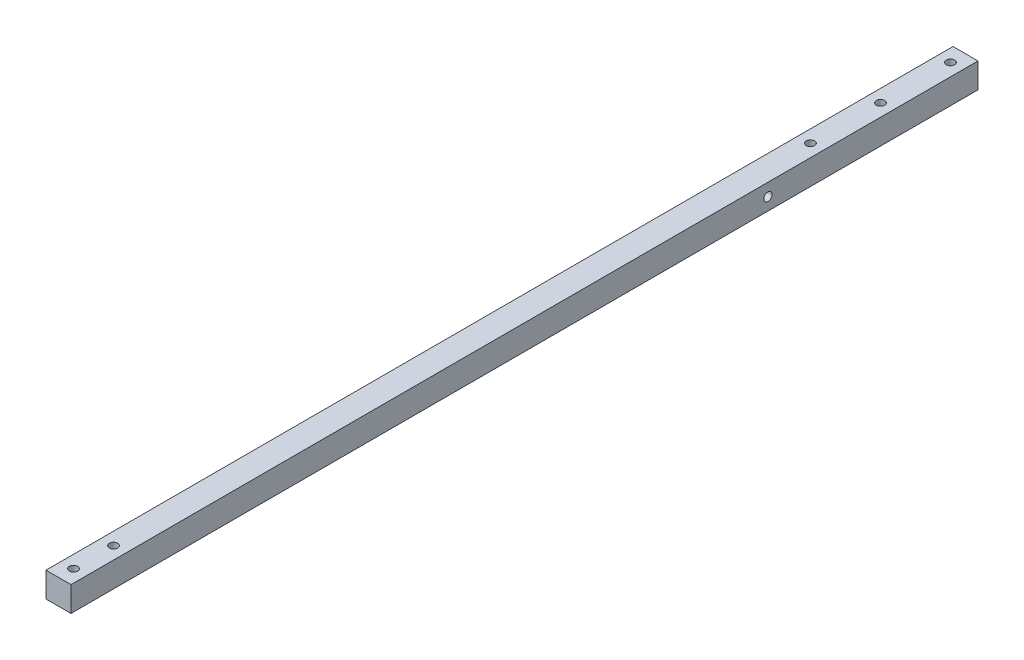
ISO-10303-21;
HEADER;
FILE_DESCRIPTION(('STEP AP214'),'2;1');
FILE_NAME('part.step','',(''),(''),'','','');
FILE_SCHEMA(('AUTOMOTIVE_DESIGN { 1 0 10303 214 1 1 1 1 }'));
ENDSEC;
DATA;
#1=APPLICATION_CONTEXT('core data for automotive mechanical design processes');
#2=APPLICATION_PROTOCOL_DEFINITION('international standard','automotive_design',2000,#1);
#3=PRODUCT_CONTEXT('',#1,'mechanical');
#4=PRODUCT('Part','Part','',(#3));
#5=PRODUCT_RELATED_PRODUCT_CATEGORY('part','',(#4));
#6=PRODUCT_DEFINITION_FORMATION('','',#4);
#7=PRODUCT_DEFINITION_CONTEXT('part definition',#1,'design');
#8=PRODUCT_DEFINITION('design','',#6,#7);
#9=PRODUCT_DEFINITION_SHAPE('','',#8);
#10=(LENGTH_UNIT() NAMED_UNIT(*) SI_UNIT(.MILLI.,.METRE.));
#11=(NAMED_UNIT(*) PLANE_ANGLE_UNIT() SI_UNIT($,.RADIAN.));
#12=(NAMED_UNIT(*) SI_UNIT($,.STERADIAN.) SOLID_ANGLE_UNIT());
#13=UNCERTAINTY_MEASURE_WITH_UNIT(LENGTH_MEASURE(1.E-05),#10,'distance_accuracy_value','');
#14=(GEOMETRIC_REPRESENTATION_CONTEXT(3) GLOBAL_UNCERTAINTY_ASSIGNED_CONTEXT((#13)) GLOBAL_UNIT_ASSIGNED_CONTEXT((#10,
#11,#12)) REPRESENTATION_CONTEXT('',''));
#15=CARTESIAN_POINT('',(0.,0.,0.));
#16=DIRECTION('',(0.,0.,1.));
#17=DIRECTION('',(1.,0.,0.));
#18=AXIS2_PLACEMENT_3D('',#15,#16,#17);
#19=CARTESIAN_POINT('',(3.75,-3.75,272.));
#20=DIRECTION('',(-1.,0.,0.));
#21=DIRECTION('',(0.,0.,1.));
#22=AXIS2_PLACEMENT_3D('',#19,#20,#21);
#23=PLANE('',#22);
#24=CARTESIAN_POINT('',(3.75,0.,63.));
#25=DIRECTION('',(1.,0.,0.));
#26=DIRECTION('',(0.,0.,-1.));
#27=AXIS2_PLACEMENT_3D('',#24,#25,#26);
#28=CIRCLE('',#27,1.25000000000001);
#29=CARTESIAN_POINT('',(3.75,0.,61.75));
#30=VERTEX_POINT('',#29);
#31=EDGE_CURVE('E140',#30,#30,#28,.T.);
#32=ORIENTED_EDGE('',*,*,#31,.F.);
#33=EDGE_LOOP('',(#32));
#34=FACE_BOUND('',#33,.T.);
#35=DIRECTION('',(0.,1.,0.));
#36=VECTOR('',#35,1.);
#37=CARTESIAN_POINT('',(3.75,-3.75,0.));
#38=LINE('',#37,#36);
#39=CARTESIAN_POINT('',(3.75,-3.75,0.));
#40=VERTEX_POINT('',#39);
#41=CARTESIAN_POINT('',(3.75,3.75,0.));
#42=VERTEX_POINT('',#41);
#43=EDGE_CURVE('E96',#40,#42,#38,.T.);
#44=ORIENTED_EDGE('',*,*,#43,.T.);
#45=DIRECTION('',(0.,0.,-1.));
#46=VECTOR('',#45,1.);
#47=CARTESIAN_POINT('',(3.75,3.75,272.));
#48=LINE('',#47,#46);
#49=CARTESIAN_POINT('',(3.75,3.75,272.));
#50=VERTEX_POINT('',#49);
#51=EDGE_CURVE('E11',#50,#42,#48,.T.);
#52=ORIENTED_EDGE('',*,*,#51,.F.);
#53=DIRECTION('',(0.,1.,0.));
#54=VECTOR('',#53,1.);
#55=CARTESIAN_POINT('',(3.75,-3.75,272.));
#56=LINE('',#55,#54);
#57=CARTESIAN_POINT('',(3.75,-3.75,272.));
#58=VERTEX_POINT('',#57);
#59=EDGE_CURVE('E84',#58,#50,#56,.T.);
#60=ORIENTED_EDGE('',*,*,#59,.F.);
#61=DIRECTION('',(0.,0.,-1.));
#62=VECTOR('',#61,1.);
#63=CARTESIAN_POINT('',(3.75,-3.75,272.));
#64=LINE('',#63,#62);
#65=EDGE_CURVE('E92',#58,#40,#64,.T.);
#66=ORIENTED_EDGE('',*,*,#65,.T.);
#67=EDGE_LOOP('',(#44,#52,#60,#66));
#68=FACE_BOUND('',#67,.T.);
#69=ADVANCED_FACE('F33',(#34,#68),#23,.F.);
#70=CARTESIAN_POINT('',(-3.75,3.75,272.));
#71=DIRECTION('',(0.,-1.,0.));
#72=DIRECTION('',(0.,0.,-1.));
#73=AXIS2_PLACEMENT_3D('',#70,#71,#72);
#74=PLANE('',#73);
#75=CARTESIAN_POINT('',(0.,3.75,267.5));
#76=DIRECTION('',(0.,1.,0.));
#77=DIRECTION('',(0.,0.,1.));
#78=AXIS2_PLACEMENT_3D('',#75,#76,#77);
#79=CIRCLE('',#78,1.25);
#80=CARTESIAN_POINT('',(0.,3.75,268.75));
#81=VERTEX_POINT('',#80);
#82=EDGE_CURVE('E134',#81,#81,#79,.T.);
#83=ORIENTED_EDGE('',*,*,#82,.F.);
#84=EDGE_LOOP('',(#83));
#85=FACE_BOUND('',#84,.T.);
#86=CARTESIAN_POINT('',(0.,3.75,255.5));
#87=DIRECTION('',(0.,1.,0.));
#88=DIRECTION('',(0.,0.,1.));
#89=AXIS2_PLACEMENT_3D('',#86,#87,#88);
#90=CIRCLE('',#89,1.25);
#91=CARTESIAN_POINT('',(0.,3.75,256.75));
#92=VERTEX_POINT('',#91);
#93=EDGE_CURVE('E128',#92,#92,#90,.T.);
#94=ORIENTED_EDGE('',*,*,#93,.F.);
#95=EDGE_LOOP('',(#94));
#96=FACE_BOUND('',#95,.T.);
#97=CARTESIAN_POINT('',(0.,3.75,46.5));
#98=DIRECTION('',(0.,1.,0.));
#99=DIRECTION('',(0.,0.,1.));
#100=AXIS2_PLACEMENT_3D('',#97,#98,#99);
#101=CIRCLE('',#100,1.25);
#102=CARTESIAN_POINT('',(0.,3.75,47.75));
#103=VERTEX_POINT('',#102);
#104=EDGE_CURVE('E122',#103,#103,#101,.T.);
#105=ORIENTED_EDGE('',*,*,#104,.F.);
#106=EDGE_LOOP('',(#105));
#107=FACE_BOUND('',#106,.T.);
#108=CARTESIAN_POINT('',(0.,3.75,25.5));
#109=DIRECTION('',(0.,1.,0.));
#110=DIRECTION('',(0.,0.,1.));
#111=AXIS2_PLACEMENT_3D('',#108,#109,#110);
#112=CIRCLE('',#111,1.25);
#113=CARTESIAN_POINT('',(0.,3.75,26.75));
#114=VERTEX_POINT('',#113);
#115=EDGE_CURVE('E116',#114,#114,#112,.T.);
#116=ORIENTED_EDGE('',*,*,#115,.F.);
#117=EDGE_LOOP('',(#116));
#118=FACE_BOUND('',#117,.T.);
#119=CARTESIAN_POINT('',(0.,3.75,4.5));
#120=DIRECTION('',(0.,1.,0.));
#121=DIRECTION('',(0.,0.,1.));
#122=AXIS2_PLACEMENT_3D('',#119,#120,#121);
#123=CIRCLE('',#122,1.25);
#124=CARTESIAN_POINT('',(0.,3.75,5.75));
#125=VERTEX_POINT('',#124);
#126=EDGE_CURVE('E110',#125,#125,#123,.T.);
#127=ORIENTED_EDGE('',*,*,#126,.F.);
#128=EDGE_LOOP('',(#127));
#129=FACE_BOUND('',#128,.T.);
#130=DIRECTION('',(-1.,0.,0.));
#131=VECTOR('',#130,1.);
#132=CARTESIAN_POINT('',(-3.75,3.75,0.));
#133=LINE('',#132,#131);
#134=CARTESIAN_POINT('',(-3.75,3.75,0.));
#135=VERTEX_POINT('',#134);
#136=EDGE_CURVE('E88',#42,#135,#133,.T.);
#137=ORIENTED_EDGE('',*,*,#136,.T.);
#138=DIRECTION('',(0.,0.,-1.));
#139=VECTOR('',#138,1.);
#140=CARTESIAN_POINT('',(-3.75,3.75,272.));
#141=LINE('',#140,#139);
#142=CARTESIAN_POINT('',(-3.75,3.75,272.));
#143=VERTEX_POINT('',#142);
#144=EDGE_CURVE('E41',#143,#135,#141,.T.);
#145=ORIENTED_EDGE('',*,*,#144,.F.);
#146=DIRECTION('',(-1.,0.,0.));
#147=VECTOR('',#146,1.);
#148=CARTESIAN_POINT('',(-3.75,3.75,272.));
#149=LINE('',#148,#147);
#150=EDGE_CURVE('E79',#50,#143,#149,.T.);
#151=ORIENTED_EDGE('',*,*,#150,.F.);
#152=ORIENTED_EDGE('',*,*,#51,.T.);
#153=EDGE_LOOP('',(#137,#145,#151,#152));
#154=FACE_BOUND('',#153,.T.);
#155=ADVANCED_FACE('F87',(#85,#96,#107,#118,#129,#154),#74,.F.);
#156=CARTESIAN_POINT('',(-3.75,-3.75,272.));
#157=DIRECTION('',(1.,0.,0.));
#158=DIRECTION('',(0.,0.,-1.));
#159=AXIS2_PLACEMENT_3D('',#156,#157,#158);
#160=PLANE('',#159);
#161=CARTESIAN_POINT('',(-3.75,0.,63.));
#162=DIRECTION('',(1.,0.,0.));
#163=DIRECTION('',(0.,0.,-1.));
#164=AXIS2_PLACEMENT_3D('',#161,#162,#163);
#165=CIRCLE('',#164,1.25000000000001);
#166=CARTESIAN_POINT('',(-3.75,0.,61.75));
#167=VERTEX_POINT('',#166);
#168=EDGE_CURVE('E137',#167,#167,#165,.T.);
#169=ORIENTED_EDGE('',*,*,#168,.T.);
#170=EDGE_LOOP('',(#169));
#171=FACE_BOUND('',#170,.T.);
#172=DIRECTION('',(0.,-1.,0.));
#173=VECTOR('',#172,1.);
#174=CARTESIAN_POINT('',(-3.75,-3.75,0.));
#175=LINE('',#174,#173);
#176=CARTESIAN_POINT('',(-3.75,-3.75,0.));
#177=VERTEX_POINT('',#176);
#178=EDGE_CURVE('E66',#135,#177,#175,.T.);
#179=ORIENTED_EDGE('',*,*,#178,.T.);
#180=DIRECTION('',(0.,0.,-1.));
#181=VECTOR('',#180,1.);
#182=CARTESIAN_POINT('',(-3.75,-3.75,272.));
#183=LINE('',#182,#181);
#184=CARTESIAN_POINT('',(-3.75,-3.75,272.));
#185=VERTEX_POINT('',#184);
#186=EDGE_CURVE('E89',#185,#177,#183,.T.);
#187=ORIENTED_EDGE('',*,*,#186,.F.);
#188=DIRECTION('',(0.,-1.,0.));
#189=VECTOR('',#188,1.);
#190=CARTESIAN_POINT('',(-3.75,-3.75,272.));
#191=LINE('',#190,#189);
#192=EDGE_CURVE('E82',#143,#185,#191,.T.);
#193=ORIENTED_EDGE('',*,*,#192,.F.);
#194=ORIENTED_EDGE('',*,*,#144,.T.);
#195=EDGE_LOOP('',(#179,#187,#193,#194));
#196=FACE_BOUND('',#195,.T.);
#197=ADVANCED_FACE('F90',(#171,#196),#160,.F.);
#198=CARTESIAN_POINT('',(-3.75,-3.75,272.));
#199=DIRECTION('',(0.,1.,0.));
#200=DIRECTION('',(0.,0.,1.));
#201=AXIS2_PLACEMENT_3D('',#198,#199,#200);
#202=PLANE('',#201);
#203=CARTESIAN_POINT('',(0.,-3.75,267.5));
#204=DIRECTION('',(0.,1.,0.));
#205=DIRECTION('',(0.,0.,1.));
#206=AXIS2_PLACEMENT_3D('',#203,#204,#205);
#207=CIRCLE('',#206,1.25);
#208=CARTESIAN_POINT('',(0.,-3.75,268.75));
#209=VERTEX_POINT('',#208);
#210=EDGE_CURVE('E131',#209,#209,#207,.T.);
#211=ORIENTED_EDGE('',*,*,#210,.T.);
#212=EDGE_LOOP('',(#211));
#213=FACE_BOUND('',#212,.T.);
#214=CARTESIAN_POINT('',(0.,-3.75,255.5));
#215=DIRECTION('',(0.,1.,0.));
#216=DIRECTION('',(0.,0.,1.));
#217=AXIS2_PLACEMENT_3D('',#214,#215,#216);
#218=CIRCLE('',#217,1.25);
#219=CARTESIAN_POINT('',(0.,-3.75,256.75));
#220=VERTEX_POINT('',#219);
#221=EDGE_CURVE('E125',#220,#220,#218,.T.);
#222=ORIENTED_EDGE('',*,*,#221,.T.);
#223=EDGE_LOOP('',(#222));
#224=FACE_BOUND('',#223,.T.);
#225=CARTESIAN_POINT('',(0.,-3.75,46.5));
#226=DIRECTION('',(0.,1.,0.));
#227=DIRECTION('',(0.,0.,1.));
#228=AXIS2_PLACEMENT_3D('',#225,#226,#227);
#229=CIRCLE('',#228,1.25);
#230=CARTESIAN_POINT('',(0.,-3.75,47.75));
#231=VERTEX_POINT('',#230);
#232=EDGE_CURVE('E119',#231,#231,#229,.T.);
#233=ORIENTED_EDGE('',*,*,#232,.T.);
#234=EDGE_LOOP('',(#233));
#235=FACE_BOUND('',#234,.T.);
#236=CARTESIAN_POINT('',(0.,-3.75,25.5));
#237=DIRECTION('',(0.,1.,0.));
#238=DIRECTION('',(0.,0.,1.));
#239=AXIS2_PLACEMENT_3D('',#236,#237,#238);
#240=CIRCLE('',#239,1.25);
#241=CARTESIAN_POINT('',(0.,-3.75,26.75));
#242=VERTEX_POINT('',#241);
#243=EDGE_CURVE('E113',#242,#242,#240,.T.);
#244=ORIENTED_EDGE('',*,*,#243,.T.);
#245=EDGE_LOOP('',(#244));
#246=FACE_BOUND('',#245,.T.);
#247=CARTESIAN_POINT('',(0.,-3.75,4.5));
#248=DIRECTION('',(0.,1.,0.));
#249=DIRECTION('',(0.,0.,1.));
#250=AXIS2_PLACEMENT_3D('',#247,#248,#249);
#251=CIRCLE('',#250,1.25);
#252=CARTESIAN_POINT('',(0.,-3.75,5.75));
#253=VERTEX_POINT('',#252);
#254=EDGE_CURVE('E99',#253,#253,#251,.T.);
#255=ORIENTED_EDGE('',*,*,#254,.T.);
#256=EDGE_LOOP('',(#255));
#257=FACE_BOUND('',#256,.T.);
#258=DIRECTION('',(1.,0.,0.));
#259=VECTOR('',#258,1.);
#260=CARTESIAN_POINT('',(-3.75,-3.75,0.));
#261=LINE('',#260,#259);
#262=EDGE_CURVE('E72',#177,#40,#261,.T.);
#263=ORIENTED_EDGE('',*,*,#262,.T.);
#264=ORIENTED_EDGE('',*,*,#65,.F.);
#265=DIRECTION('',(1.,0.,0.));
#266=VECTOR('',#265,1.);
#267=CARTESIAN_POINT('',(-3.75,-3.75,272.));
#268=LINE('',#267,#266);
#269=EDGE_CURVE('E49',#185,#58,#268,.T.);
#270=ORIENTED_EDGE('',*,*,#269,.F.);
#271=ORIENTED_EDGE('',*,*,#186,.T.);
#272=EDGE_LOOP('',(#263,#264,#270,#271));
#273=FACE_BOUND('',#272,.T.);
#274=ADVANCED_FACE('F104',(#213,#224,#235,#246,#257,#273),#202,.F.);
#275=CARTESIAN_POINT('',(0.,0.,272.));
#276=DIRECTION('',(0.,0.,-1.));
#277=DIRECTION('',(-1.,0.,0.));
#278=AXIS2_PLACEMENT_3D('',#275,#276,#277);
#279=PLANE('',#278);
#280=ORIENTED_EDGE('',*,*,#59,.T.);
#281=ORIENTED_EDGE('',*,*,#150,.T.);
#282=ORIENTED_EDGE('',*,*,#192,.T.);
#283=ORIENTED_EDGE('',*,*,#269,.T.);
#284=EDGE_LOOP('',(#280,#281,#282,#283));
#285=FACE_BOUND('',#284,.T.);
#286=ADVANCED_FACE('F80',(#285),#279,.F.);
#287=CARTESIAN_POINT('',(0.,0.,0.));
#288=DIRECTION('',(0.,0.,-1.));
#289=DIRECTION('',(-1.,0.,0.));
#290=AXIS2_PLACEMENT_3D('',#287,#288,#289);
#291=PLANE('',#290);
#292=ORIENTED_EDGE('',*,*,#43,.F.);
#293=ORIENTED_EDGE('',*,*,#262,.F.);
#294=ORIENTED_EDGE('',*,*,#178,.F.);
#295=ORIENTED_EDGE('',*,*,#136,.F.);
#296=EDGE_LOOP('',(#292,#293,#294,#295));
#297=FACE_BOUND('',#296,.T.);
#298=ADVANCED_FACE('F107',(#297),#291,.T.);
#299=CARTESIAN_POINT('',(0.,-3.75,4.5));
#300=DIRECTION('',(0.,1.,0.));
#301=DIRECTION('',(0.,0.,1.));
#302=AXIS2_PLACEMENT_3D('',#299,#300,#301);
#303=CYLINDRICAL_SURFACE('',#302,1.25);
#304=ORIENTED_EDGE('',*,*,#254,.F.);
#305=EDGE_LOOP('',(#304));
#306=FACE_BOUND('',#305,.T.);
#307=ORIENTED_EDGE('',*,*,#126,.T.);
#308=EDGE_LOOP('',(#307));
#309=FACE_BOUND('',#308,.T.);
#310=ADVANCED_FACE('F171',(#306,#309),#303,.F.);
#311=CARTESIAN_POINT('',(0.,-3.75,25.5));
#312=DIRECTION('',(0.,1.,0.));
#313=DIRECTION('',(0.,0.,1.));
#314=AXIS2_PLACEMENT_3D('',#311,#312,#313);
#315=CYLINDRICAL_SURFACE('',#314,1.25);
#316=ORIENTED_EDGE('',*,*,#243,.F.);
#317=EDGE_LOOP('',(#316));
#318=FACE_BOUND('',#317,.T.);
#319=ORIENTED_EDGE('',*,*,#115,.T.);
#320=EDGE_LOOP('',(#319));
#321=FACE_BOUND('',#320,.T.);
#322=ADVANCED_FACE('F176',(#318,#321),#315,.F.);
#323=CARTESIAN_POINT('',(0.,-3.75,46.5));
#324=DIRECTION('',(0.,1.,0.));
#325=DIRECTION('',(0.,0.,1.));
#326=AXIS2_PLACEMENT_3D('',#323,#324,#325);
#327=CYLINDRICAL_SURFACE('',#326,1.25);
#328=ORIENTED_EDGE('',*,*,#232,.F.);
#329=EDGE_LOOP('',(#328));
#330=FACE_BOUND('',#329,.T.);
#331=ORIENTED_EDGE('',*,*,#104,.T.);
#332=EDGE_LOOP('',(#331));
#333=FACE_BOUND('',#332,.T.);
#334=ADVANCED_FACE('F180',(#330,#333),#327,.F.);
#335=CARTESIAN_POINT('',(0.,-3.75,255.5));
#336=DIRECTION('',(0.,1.,0.));
#337=DIRECTION('',(0.,0.,1.));
#338=AXIS2_PLACEMENT_3D('',#335,#336,#337);
#339=CYLINDRICAL_SURFACE('',#338,1.25);
#340=ORIENTED_EDGE('',*,*,#221,.F.);
#341=EDGE_LOOP('',(#340));
#342=FACE_BOUND('',#341,.T.);
#343=ORIENTED_EDGE('',*,*,#93,.T.);
#344=EDGE_LOOP('',(#343));
#345=FACE_BOUND('',#344,.T.);
#346=ADVANCED_FACE('F184',(#342,#345),#339,.F.);
#347=CARTESIAN_POINT('',(0.,-3.75,267.5));
#348=DIRECTION('',(0.,1.,0.));
#349=DIRECTION('',(0.,0.,1.));
#350=AXIS2_PLACEMENT_3D('',#347,#348,#349);
#351=CYLINDRICAL_SURFACE('',#350,1.25);
#352=ORIENTED_EDGE('',*,*,#210,.F.);
#353=EDGE_LOOP('',(#352));
#354=FACE_BOUND('',#353,.T.);
#355=ORIENTED_EDGE('',*,*,#82,.T.);
#356=EDGE_LOOP('',(#355));
#357=FACE_BOUND('',#356,.T.);
#358=ADVANCED_FACE('F150',(#354,#357),#351,.F.);
#359=CARTESIAN_POINT('',(-3.75,0.,63.));
#360=DIRECTION('',(1.,0.,0.));
#361=DIRECTION('',(0.,0.,-1.));
#362=AXIS2_PLACEMENT_3D('',#359,#360,#361);
#363=CYLINDRICAL_SURFACE('',#362,1.25000000000001);
#364=ORIENTED_EDGE('',*,*,#168,.F.);
#365=EDGE_LOOP('',(#364));
#366=FACE_BOUND('',#365,.T.);
#367=ORIENTED_EDGE('',*,*,#31,.T.);
#368=EDGE_LOOP('',(#367));
#369=FACE_BOUND('',#368,.T.);
#370=ADVANCED_FACE('F147',(#366,#369),#363,.F.);
#371=CLOSED_SHELL('',(#69,#155,#197,#274,#286,#298,#310,#322,#334,#346,#358,#370));
#372=MANIFOLD_SOLID_BREP('B2',#371);
#373=ADVANCED_BREP_SHAPE_REPRESENTATION('',(#18,#372),#14);
#374=SHAPE_DEFINITION_REPRESENTATION(#9,#373);
ENDSEC;
END-ISO-10303-21;
